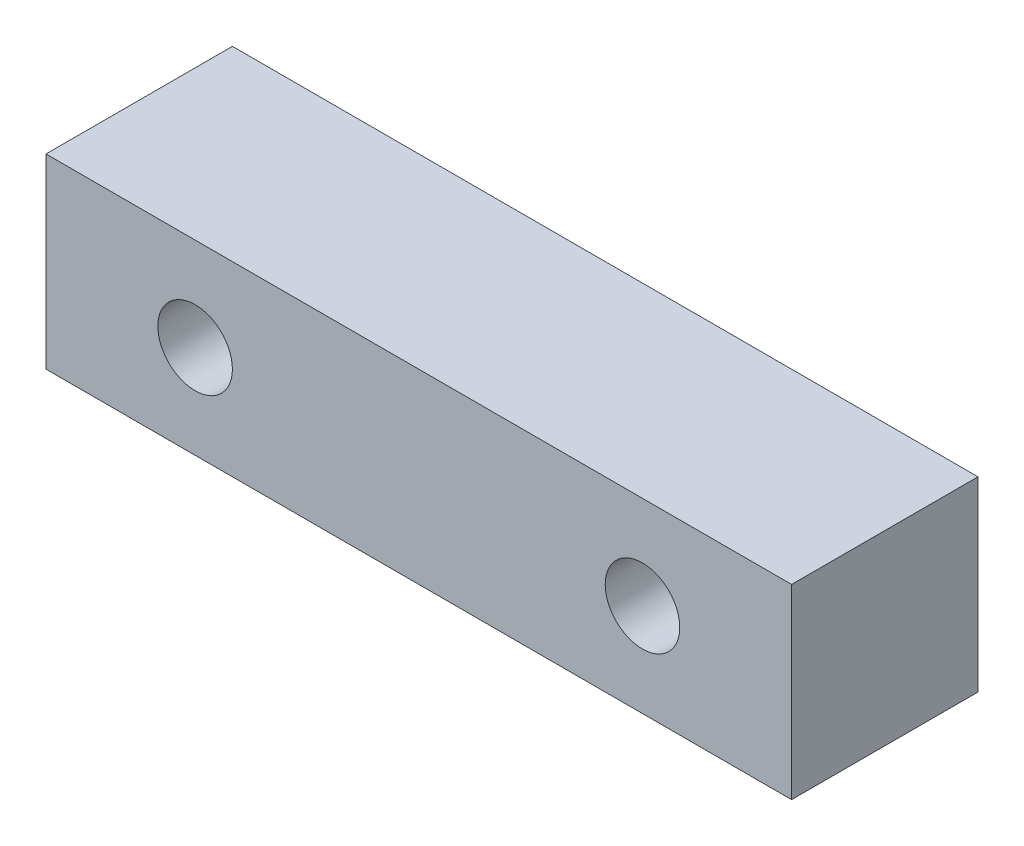
ISO-10303-21;
HEADER;
FILE_DESCRIPTION(('STEP AP214'),'2;1');
FILE_NAME('part.step','',(''),(''),'','','');
FILE_SCHEMA(('AUTOMOTIVE_DESIGN { 1 0 10303 214 1 1 1 1 }'));
ENDSEC;
DATA;
#1=APPLICATION_CONTEXT('core data for automotive mechanical design processes');
#2=APPLICATION_PROTOCOL_DEFINITION('international standard','automotive_design',2000,#1);
#3=PRODUCT_CONTEXT('',#1,'mechanical');
#4=PRODUCT('Part','Part','',(#3));
#5=PRODUCT_RELATED_PRODUCT_CATEGORY('part','',(#4));
#6=PRODUCT_DEFINITION_FORMATION('','',#4);
#7=PRODUCT_DEFINITION_CONTEXT('part definition',#1,'design');
#8=PRODUCT_DEFINITION('design','',#6,#7);
#9=PRODUCT_DEFINITION_SHAPE('','',#8);
#10=(LENGTH_UNIT() NAMED_UNIT(*) SI_UNIT(.MILLI.,.METRE.));
#11=(NAMED_UNIT(*) PLANE_ANGLE_UNIT() SI_UNIT($,.RADIAN.));
#12=(NAMED_UNIT(*) SI_UNIT($,.STERADIAN.) SOLID_ANGLE_UNIT());
#13=UNCERTAINTY_MEASURE_WITH_UNIT(LENGTH_MEASURE(1.E-05),#10,'distance_accuracy_value','');
#14=(GEOMETRIC_REPRESENTATION_CONTEXT(3) GLOBAL_UNCERTAINTY_ASSIGNED_CONTEXT((#13)) GLOBAL_UNIT_ASSIGNED_CONTEXT((#10,
#11,#12)) REPRESENTATION_CONTEXT('',''));
#15=CARTESIAN_POINT('',(0.,0.,0.));
#16=DIRECTION('',(0.,0.,1.));
#17=DIRECTION('',(1.,0.,0.));
#18=AXIS2_PLACEMENT_3D('',#15,#16,#17);
#19=CARTESIAN_POINT('',(0.,0.,5.));
#20=DIRECTION('',(0.,0.,-1.));
#21=DIRECTION('',(-1.,0.,0.));
#22=AXIS2_PLACEMENT_3D('',#19,#20,#21);
#23=PLANE('',#22);
#24=DIRECTION('',(1.,0.,0.));
#25=VECTOR('',#24,1.);
#26=CARTESIAN_POINT('',(-10.,-2.5,5.));
#27=LINE('',#26,#25);
#28=CARTESIAN_POINT('',(-10.,-2.5,5.));
#29=VERTEX_POINT('',#28);
#30=CARTESIAN_POINT('',(10.,-2.5,5.));
#31=VERTEX_POINT('',#30);
#32=EDGE_CURVE('E92',#29,#31,#27,.T.);
#33=ORIENTED_EDGE('',*,*,#32,.T.);
#34=DIRECTION('',(0.,1.,0.));
#35=VECTOR('',#34,1.);
#36=CARTESIAN_POINT('',(10.,2.5,5.));
#37=LINE('',#36,#35);
#38=CARTESIAN_POINT('',(10.,2.5,5.));
#39=VERTEX_POINT('',#38);
#40=EDGE_CURVE('E87',#31,#39,#37,.T.);
#41=ORIENTED_EDGE('',*,*,#40,.T.);
#42=DIRECTION('',(-1.,0.,0.));
#43=VECTOR('',#42,1.);
#44=CARTESIAN_POINT('',(-10.,2.5,5.));
#45=LINE('',#44,#43);
#46=CARTESIAN_POINT('',(-10.,2.5,5.));
#47=VERTEX_POINT('',#46);
#48=EDGE_CURVE('E90',#39,#47,#45,.T.);
#49=ORIENTED_EDGE('',*,*,#48,.T.);
#50=DIRECTION('',(0.,-1.,0.));
#51=VECTOR('',#50,1.);
#52=CARTESIAN_POINT('',(-10.,2.5,5.));
#53=LINE('',#52,#51);
#54=EDGE_CURVE('E57',#47,#29,#53,.T.);
#55=ORIENTED_EDGE('',*,*,#54,.T.);
#56=EDGE_LOOP('',(#33,#41,#49,#55));
#57=FACE_BOUND('',#56,.T.);
#58=CARTESIAN_POINT('',(-6.,0.,5.));
#59=DIRECTION('',(0.,0.,1.));
#60=DIRECTION('',(1.,0.,0.));
#61=AXIS2_PLACEMENT_3D('',#58,#59,#60);
#62=CIRCLE('',#61,1.);
#63=CARTESIAN_POINT('',(-5.,0.,5.));
#64=VERTEX_POINT('',#63);
#65=EDGE_CURVE('E112',#64,#64,#62,.T.);
#66=ORIENTED_EDGE('',*,*,#65,.F.);
#67=EDGE_LOOP('',(#66));
#68=FACE_BOUND('',#67,.T.);
#69=CARTESIAN_POINT('',(6.,0.,5.));
#70=DIRECTION('',(0.,0.,1.));
#71=DIRECTION('',(-1.,0.,0.));
#72=AXIS2_PLACEMENT_3D('',#69,#70,#71);
#73=CIRCLE('',#72,1.);
#74=CARTESIAN_POINT('',(5.,0.,5.));
#75=VERTEX_POINT('',#74);
#76=EDGE_CURVE('E134',#75,#75,#73,.T.);
#77=ORIENTED_EDGE('',*,*,#76,.F.);
#78=EDGE_LOOP('',(#77));
#79=FACE_BOUND('',#78,.T.);
#80=ADVANCED_FACE('F39',(#57,#68,#79),#23,.F.);
#81=CARTESIAN_POINT('',(0.,0.,0.));
#82=DIRECTION('',(0.,0.,-1.));
#83=DIRECTION('',(-1.,0.,0.));
#84=AXIS2_PLACEMENT_3D('',#81,#82,#83);
#85=PLANE('',#84);
#86=CARTESIAN_POINT('',(-6.,0.,0.));
#87=DIRECTION('',(0.,0.,1.));
#88=DIRECTION('',(1.,0.,0.));
#89=AXIS2_PLACEMENT_3D('',#86,#87,#88);
#90=CIRCLE('',#89,1.);
#91=CARTESIAN_POINT('',(-5.,0.,0.));
#92=VERTEX_POINT('',#91);
#93=EDGE_CURVE('E130',#92,#92,#90,.T.);
#94=ORIENTED_EDGE('',*,*,#93,.T.);
#95=EDGE_LOOP('',(#94));
#96=FACE_BOUND('',#95,.T.);
#97=DIRECTION('',(1.,0.,0.));
#98=VECTOR('',#97,1.);
#99=CARTESIAN_POINT('',(-10.,-2.5,0.));
#100=LINE('',#99,#98);
#101=CARTESIAN_POINT('',(-10.,-2.5,0.));
#102=VERTEX_POINT('',#101);
#103=CARTESIAN_POINT('',(10.,-2.5,0.));
#104=VERTEX_POINT('',#103);
#105=EDGE_CURVE('E108',#102,#104,#100,.T.);
#106=ORIENTED_EDGE('',*,*,#105,.F.);
#107=DIRECTION('',(0.,-1.,0.));
#108=VECTOR('',#107,1.);
#109=CARTESIAN_POINT('',(-10.,2.5,0.));
#110=LINE('',#109,#108);
#111=CARTESIAN_POINT('',(-10.,2.5,0.));
#112=VERTEX_POINT('',#111);
#113=EDGE_CURVE('E80',#112,#102,#110,.T.);
#114=ORIENTED_EDGE('',*,*,#113,.F.);
#115=DIRECTION('',(-1.,0.,0.));
#116=VECTOR('',#115,1.);
#117=CARTESIAN_POINT('',(-10.,2.5,0.));
#118=LINE('',#117,#116);
#119=CARTESIAN_POINT('',(10.,2.5,0.));
#120=VERTEX_POINT('',#119);
#121=EDGE_CURVE('E74',#120,#112,#118,.T.);
#122=ORIENTED_EDGE('',*,*,#121,.F.);
#123=DIRECTION('',(0.,1.,0.));
#124=VECTOR('',#123,1.);
#125=CARTESIAN_POINT('',(10.,2.5,0.));
#126=LINE('',#125,#124);
#127=EDGE_CURVE('E97',#104,#120,#126,.T.);
#128=ORIENTED_EDGE('',*,*,#127,.F.);
#129=EDGE_LOOP('',(#106,#114,#122,#128));
#130=FACE_BOUND('',#129,.T.);
#131=CARTESIAN_POINT('',(6.,0.,0.));
#132=DIRECTION('',(0.,0.,1.));
#133=DIRECTION('',(-1.,0.,0.));
#134=AXIS2_PLACEMENT_3D('',#131,#132,#133);
#135=CIRCLE('',#134,1.);
#136=CARTESIAN_POINT('',(5.,0.,0.));
#137=VERTEX_POINT('',#136);
#138=EDGE_CURVE('E138',#137,#137,#135,.T.);
#139=ORIENTED_EDGE('',*,*,#138,.T.);
#140=EDGE_LOOP('',(#139));
#141=FACE_BOUND('',#140,.T.);
#142=ADVANCED_FACE('F125',(#96,#130,#141),#85,.T.);
#143=CARTESIAN_POINT('',(-10.,-2.5,5.));
#144=DIRECTION('',(0.,1.,0.));
#145=DIRECTION('',(-1.,0.,0.));
#146=AXIS2_PLACEMENT_3D('',#143,#144,#145);
#147=PLANE('',#146);
#148=ORIENTED_EDGE('',*,*,#105,.T.);
#149=DIRECTION('',(0.,0.,-1.));
#150=VECTOR('',#149,1.);
#151=CARTESIAN_POINT('',(10.,-2.5,5.));
#152=LINE('',#151,#150);
#153=EDGE_CURVE('E11',#31,#104,#152,.T.);
#154=ORIENTED_EDGE('',*,*,#153,.F.);
#155=ORIENTED_EDGE('',*,*,#32,.F.);
#156=DIRECTION('',(0.,0.,-1.));
#157=VECTOR('',#156,1.);
#158=CARTESIAN_POINT('',(-10.,-2.5,5.));
#159=LINE('',#158,#157);
#160=EDGE_CURVE('E104',#29,#102,#159,.T.);
#161=ORIENTED_EDGE('',*,*,#160,.T.);
#162=EDGE_LOOP('',(#148,#154,#155,#161));
#163=FACE_BOUND('',#162,.T.);
#164=ADVANCED_FACE('F41',(#163),#147,.F.);
#165=CARTESIAN_POINT('',(10.,2.5,5.));
#166=DIRECTION('',(-1.,0.,0.));
#167=DIRECTION('',(0.,0.,1.));
#168=AXIS2_PLACEMENT_3D('',#165,#166,#167);
#169=PLANE('',#168);
#170=ORIENTED_EDGE('',*,*,#127,.T.);
#171=DIRECTION('',(0.,0.,-1.));
#172=VECTOR('',#171,1.);
#173=CARTESIAN_POINT('',(10.,2.5,5.));
#174=LINE('',#173,#172);
#175=EDGE_CURVE('E49',#39,#120,#174,.T.);
#176=ORIENTED_EDGE('',*,*,#175,.F.);
#177=ORIENTED_EDGE('',*,*,#40,.F.);
#178=ORIENTED_EDGE('',*,*,#153,.T.);
#179=EDGE_LOOP('',(#170,#176,#177,#178));
#180=FACE_BOUND('',#179,.T.);
#181=ADVANCED_FACE('F96',(#180),#169,.F.);
#182=CARTESIAN_POINT('',(-10.,2.5,5.));
#183=DIRECTION('',(0.,-1.,0.));
#184=DIRECTION('',(1.,0.,0.));
#185=AXIS2_PLACEMENT_3D('',#182,#183,#184);
#186=PLANE('',#185);
#187=ORIENTED_EDGE('',*,*,#121,.T.);
#188=DIRECTION('',(0.,0.,-1.));
#189=VECTOR('',#188,1.);
#190=CARTESIAN_POINT('',(-10.,2.5,5.));
#191=LINE('',#190,#189);
#192=EDGE_CURVE('E99',#47,#112,#191,.T.);
#193=ORIENTED_EDGE('',*,*,#192,.F.);
#194=ORIENTED_EDGE('',*,*,#48,.F.);
#195=ORIENTED_EDGE('',*,*,#175,.T.);
#196=EDGE_LOOP('',(#187,#193,#194,#195));
#197=FACE_BOUND('',#196,.T.);
#198=ADVANCED_FACE('F100',(#197),#186,.F.);
#199=CARTESIAN_POINT('',(-10.,2.5,5.));
#200=DIRECTION('',(1.,0.,0.));
#201=DIRECTION('',(0.,0.,-1.));
#202=AXIS2_PLACEMENT_3D('',#199,#200,#201);
#203=PLANE('',#202);
#204=ORIENTED_EDGE('',*,*,#113,.T.);
#205=ORIENTED_EDGE('',*,*,#160,.F.);
#206=ORIENTED_EDGE('',*,*,#54,.F.);
#207=ORIENTED_EDGE('',*,*,#192,.T.);
#208=EDGE_LOOP('',(#204,#205,#206,#207));
#209=FACE_BOUND('',#208,.T.);
#210=ADVANCED_FACE('F122',(#209),#203,.F.);
#211=CARTESIAN_POINT('',(-6.,0.,5.));
#212=DIRECTION('',(0.,0.,-1.));
#213=DIRECTION('',(-1.,0.,0.));
#214=AXIS2_PLACEMENT_3D('',#211,#212,#213);
#215=CYLINDRICAL_SURFACE('',#214,1.);
#216=ORIENTED_EDGE('',*,*,#65,.T.);
#217=EDGE_LOOP('',(#216));
#218=FACE_BOUND('',#217,.T.);
#219=ORIENTED_EDGE('',*,*,#93,.F.);
#220=EDGE_LOOP('',(#219));
#221=FACE_BOUND('',#220,.T.);
#222=ADVANCED_FACE('F157',(#218,#221),#215,.F.);
#223=CARTESIAN_POINT('',(6.,0.,5.));
#224=DIRECTION('',(0.,0.,-1.));
#225=DIRECTION('',(-1.,0.,0.));
#226=AXIS2_PLACEMENT_3D('',#223,#224,#225);
#227=CYLINDRICAL_SURFACE('',#226,1.);
#228=ORIENTED_EDGE('',*,*,#76,.T.);
#229=EDGE_LOOP('',(#228));
#230=FACE_BOUND('',#229,.T.);
#231=ORIENTED_EDGE('',*,*,#138,.F.);
#232=EDGE_LOOP('',(#231));
#233=FACE_BOUND('',#232,.T.);
#234=ADVANCED_FACE('F146',(#230,#233),#227,.F.);
#235=CLOSED_SHELL('',(#80,#142,#164,#181,#198,#210,#222,#234));
#236=MANIFOLD_SOLID_BREP('B2',#235);
#237=ADVANCED_BREP_SHAPE_REPRESENTATION('',(#18,#236),#14);
#238=SHAPE_DEFINITION_REPRESENTATION(#9,#237);
ENDSEC;
END-ISO-10303-21;
